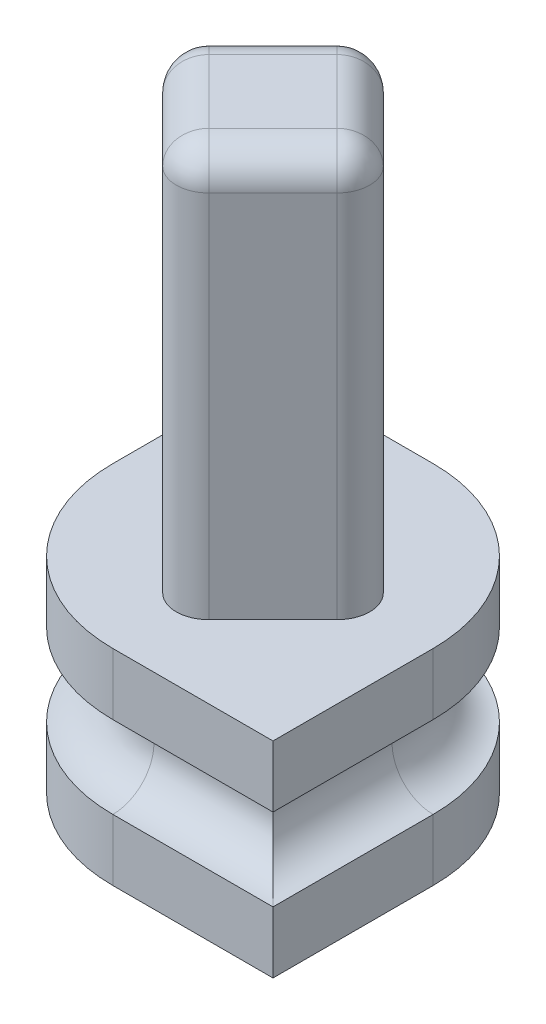
ISO-10303-21;
HEADER;
FILE_DESCRIPTION(('STEP AP214'),'2;1');
FILE_NAME('part.step','',(''),(''),'','','');
FILE_SCHEMA(('AUTOMOTIVE_DESIGN { 1 0 10303 214 1 1 1 1 }'));
ENDSEC;
DATA;
#1=APPLICATION_CONTEXT('core data for automotive mechanical design processes');
#2=APPLICATION_PROTOCOL_DEFINITION('international standard','automotive_design',2000,#1);
#3=PRODUCT_CONTEXT('',#1,'mechanical');
#4=PRODUCT('Part','Part','',(#3));
#5=PRODUCT_RELATED_PRODUCT_CATEGORY('part','',(#4));
#6=PRODUCT_DEFINITION_FORMATION('','',#4);
#7=PRODUCT_DEFINITION_CONTEXT('part definition',#1,'design');
#8=PRODUCT_DEFINITION('design','',#6,#7);
#9=PRODUCT_DEFINITION_SHAPE('','',#8);
#10=(LENGTH_UNIT() NAMED_UNIT(*) SI_UNIT(.MILLI.,.METRE.));
#11=(NAMED_UNIT(*) PLANE_ANGLE_UNIT() SI_UNIT($,.RADIAN.));
#12=(NAMED_UNIT(*) SI_UNIT($,.STERADIAN.) SOLID_ANGLE_UNIT());
#13=UNCERTAINTY_MEASURE_WITH_UNIT(LENGTH_MEASURE(1.E-05),#10,'distance_accuracy_value','');
#14=(GEOMETRIC_REPRESENTATION_CONTEXT(3) GLOBAL_UNCERTAINTY_ASSIGNED_CONTEXT((#13)) GLOBAL_UNIT_ASSIGNED_CONTEXT((#10,
#11,#12)) REPRESENTATION_CONTEXT('',''));
#15=CARTESIAN_POINT('',(0.,0.,0.));
#16=DIRECTION('',(0.,0.,1.));
#17=DIRECTION('',(1.,0.,0.));
#18=AXIS2_PLACEMENT_3D('',#15,#16,#17);
#19=CARTESIAN_POINT('',(3.9,5.,0.));
#20=DIRECTION('',(-1.,0.,0.));
#21=DIRECTION('',(0.,0.,1.));
#22=AXIS2_PLACEMENT_3D('',#19,#20,#21);
#23=PLANE('',#22);
#24=DIRECTION('',(0.,-1.,0.));
#25=VECTOR('',#24,1.);
#26=CARTESIAN_POINT('',(3.9,5.,3.9));
#27=LINE('',#26,#25);
#28=CARTESIAN_POINT('',(3.9,5.,3.9));
#29=VERTEX_POINT('',#28);
#30=CARTESIAN_POINT('',(3.9,3.5,3.9));
#31=VERTEX_POINT('',#30);
#32=EDGE_CURVE('E238',#29,#31,#27,.T.);
#33=ORIENTED_EDGE('',*,*,#32,.T.);
#34=DIRECTION('',(0.,0.,-1.));
#35=VECTOR('',#34,1.);
#36=CARTESIAN_POINT('',(3.9,3.5,0.));
#37=LINE('',#36,#35);
#38=CARTESIAN_POINT('',(3.9,3.5,0.));
#39=VERTEX_POINT('',#38);
#40=EDGE_CURVE('E429',#31,#39,#37,.T.);
#41=ORIENTED_EDGE('',*,*,#40,.T.);
#42=DIRECTION('',(0.,-1.,0.));
#43=VECTOR('',#42,1.);
#44=CARTESIAN_POINT('',(3.9,5.,0.));
#45=LINE('',#44,#43);
#46=CARTESIAN_POINT('',(3.9,5.,0.));
#47=VERTEX_POINT('',#46);
#48=EDGE_CURVE('E263',#47,#39,#45,.T.);
#49=ORIENTED_EDGE('',*,*,#48,.F.);
#50=DIRECTION('',(0.,0.,-1.));
#51=VECTOR('',#50,1.);
#52=CARTESIAN_POINT('',(3.9,5.,0.));
#53=LINE('',#52,#51);
#54=EDGE_CURVE('E380',#29,#47,#53,.T.);
#55=ORIENTED_EDGE('',*,*,#54,.F.);
#56=EDGE_LOOP('',(#33,#41,#49,#55));
#57=FACE_BOUND('',#56,.T.);
#58=ADVANCED_FACE('F33',(#57),#23,.F.);
#59=CARTESIAN_POINT('',(0.,5.,0.));
#60=DIRECTION('',(0.,-1.,0.));
#61=DIRECTION('',(0.,0.,-1.));
#62=AXIS2_PLACEMENT_3D('',#59,#60,#61);
#63=CYLINDRICAL_SURFACE('',#62,3.9);
#64=ORIENTED_EDGE('',*,*,#48,.T.);
#65=CARTESIAN_POINT('',(0.,3.5,0.));
#66=DIRECTION('',(0.,1.,0.));
#67=DIRECTION('',(0.,0.,1.));
#68=AXIS2_PLACEMENT_3D('',#65,#66,#67);
#69=CIRCLE('',#68,3.9);
#70=CARTESIAN_POINT('',(0.,3.5,-3.9));
#71=VERTEX_POINT('',#70);
#72=EDGE_CURVE('E432',#39,#71,#69,.T.);
#73=ORIENTED_EDGE('',*,*,#72,.T.);
#74=DIRECTION('',(0.,-1.,0.));
#75=VECTOR('',#74,1.);
#76=CARTESIAN_POINT('',(0.,5.,-3.9));
#77=LINE('',#76,#75);
#78=CARTESIAN_POINT('',(0.,5.,-3.9));
#79=VERTEX_POINT('',#78);
#80=EDGE_CURVE('E260',#79,#71,#77,.T.);
#81=ORIENTED_EDGE('',*,*,#80,.F.);
#82=CARTESIAN_POINT('',(0.,5.,0.));
#83=DIRECTION('',(0.,1.,0.));
#84=DIRECTION('',(0.,0.,1.));
#85=AXIS2_PLACEMENT_3D('',#82,#83,#84);
#86=CIRCLE('',#85,3.9);
#87=EDGE_CURVE('E383',#47,#79,#86,.T.);
#88=ORIENTED_EDGE('',*,*,#87,.F.);
#89=EDGE_LOOP('',(#64,#73,#81,#88));
#90=FACE_BOUND('',#89,.T.);
#91=ADVANCED_FACE('F489',(#90),#63,.T.);
#92=CARTESIAN_POINT('',(-3.9,5.,-3.9));
#93=DIRECTION('',(0.,0.,1.));
#94=DIRECTION('',(1.,0.,0.));
#95=AXIS2_PLACEMENT_3D('',#92,#93,#94);
#96=PLANE('',#95);
#97=ORIENTED_EDGE('',*,*,#80,.T.);
#98=DIRECTION('',(-1.,0.,0.));
#99=VECTOR('',#98,1.);
#100=CARTESIAN_POINT('',(-3.9,3.5,-3.9));
#101=LINE('',#100,#99);
#102=CARTESIAN_POINT('',(-3.9,3.5,-3.9));
#103=VERTEX_POINT('',#102);
#104=EDGE_CURVE('E434',#71,#103,#101,.T.);
#105=ORIENTED_EDGE('',*,*,#104,.T.);
#106=DIRECTION('',(0.,-1.,0.));
#107=VECTOR('',#106,1.);
#108=CARTESIAN_POINT('',(-3.9,5.,-3.9));
#109=LINE('',#108,#107);
#110=CARTESIAN_POINT('',(-3.9,5.,-3.9));
#111=VERTEX_POINT('',#110);
#112=EDGE_CURVE('E256',#111,#103,#109,.T.);
#113=ORIENTED_EDGE('',*,*,#112,.F.);
#114=DIRECTION('',(-1.,0.,0.));
#115=VECTOR('',#114,1.);
#116=CARTESIAN_POINT('',(-3.9,5.,-3.9));
#117=LINE('',#116,#115);
#118=EDGE_CURVE('E385',#79,#111,#117,.T.);
#119=ORIENTED_EDGE('',*,*,#118,.F.);
#120=EDGE_LOOP('',(#97,#105,#113,#119));
#121=FACE_BOUND('',#120,.T.);
#122=ADVANCED_FACE('F495',(#121),#96,.F.);
#123=CARTESIAN_POINT('',(-3.9,5.,-3.9));
#124=DIRECTION('',(1.,0.,0.));
#125=DIRECTION('',(0.,0.,-1.));
#126=AXIS2_PLACEMENT_3D('',#123,#124,#125);
#127=PLANE('',#126);
#128=ORIENTED_EDGE('',*,*,#112,.T.);
#129=DIRECTION('',(0.,0.,1.));
#130=VECTOR('',#129,1.);
#131=CARTESIAN_POINT('',(-3.9,3.5,0.));
#132=LINE('',#131,#130);
#133=CARTESIAN_POINT('',(-3.9,3.5,0.));
#134=VERTEX_POINT('',#133);
#135=EDGE_CURVE('E436',#103,#134,#132,.T.);
#136=ORIENTED_EDGE('',*,*,#135,.T.);
#137=DIRECTION('',(0.,-1.,0.));
#138=VECTOR('',#137,1.);
#139=CARTESIAN_POINT('',(-3.9,5.,0.));
#140=LINE('',#139,#138);
#141=CARTESIAN_POINT('',(-3.9,5.,0.));
#142=VERTEX_POINT('',#141);
#143=EDGE_CURVE('E252',#142,#134,#140,.T.);
#144=ORIENTED_EDGE('',*,*,#143,.F.);
#145=DIRECTION('',(0.,0.,1.));
#146=VECTOR('',#145,1.);
#147=CARTESIAN_POINT('',(-3.9,5.,-3.9));
#148=LINE('',#147,#146);
#149=EDGE_CURVE('E387',#111,#142,#148,.T.);
#150=ORIENTED_EDGE('',*,*,#149,.F.);
#151=EDGE_LOOP('',(#128,#136,#144,#150));
#152=FACE_BOUND('',#151,.T.);
#153=ADVANCED_FACE('F517',(#152),#127,.F.);
#154=CARTESIAN_POINT('',(0.,5.,0.));
#155=DIRECTION('',(0.,-1.,0.));
#156=DIRECTION('',(0.,0.,-1.));
#157=AXIS2_PLACEMENT_3D('',#154,#155,#156);
#158=CYLINDRICAL_SURFACE('',#157,3.9);
#159=ORIENTED_EDGE('',*,*,#143,.T.);
#160=CARTESIAN_POINT('',(0.,3.5,0.));
#161=DIRECTION('',(0.,1.,0.));
#162=DIRECTION('',(0.,0.,1.));
#163=AXIS2_PLACEMENT_3D('',#160,#161,#162);
#164=CIRCLE('',#163,3.9);
#165=CARTESIAN_POINT('',(0.,3.5,3.9));
#166=VERTEX_POINT('',#165);
#167=EDGE_CURVE('E425',#134,#166,#164,.T.);
#168=ORIENTED_EDGE('',*,*,#167,.T.);
#169=DIRECTION('',(0.,-1.,0.));
#170=VECTOR('',#169,1.);
#171=CARTESIAN_POINT('',(0.,5.,3.9));
#172=LINE('',#171,#170);
#173=CARTESIAN_POINT('',(0.,5.,3.9));
#174=VERTEX_POINT('',#173);
#175=EDGE_CURVE('E248',#174,#166,#172,.T.);
#176=ORIENTED_EDGE('',*,*,#175,.F.);
#177=CARTESIAN_POINT('',(0.,5.,0.));
#178=DIRECTION('',(0.,1.,0.));
#179=DIRECTION('',(0.,0.,1.));
#180=AXIS2_PLACEMENT_3D('',#177,#178,#179);
#181=CIRCLE('',#180,3.9);
#182=EDGE_CURVE('E243',#142,#174,#181,.T.);
#183=ORIENTED_EDGE('',*,*,#182,.F.);
#184=EDGE_LOOP('',(#159,#168,#176,#183));
#185=FACE_BOUND('',#184,.T.);
#186=ADVANCED_FACE('F521',(#185),#158,.T.);
#187=CARTESIAN_POINT('',(0.,5.,3.9));
#188=DIRECTION('',(0.,0.,-1.));
#189=DIRECTION('',(-1.,0.,0.));
#190=AXIS2_PLACEMENT_3D('',#187,#188,#189);
#191=PLANE('',#190);
#192=ORIENTED_EDGE('',*,*,#175,.T.);
#193=DIRECTION('',(1.,0.,0.));
#194=VECTOR('',#193,1.);
#195=CARTESIAN_POINT('',(3.9,3.5,3.9));
#196=LINE('',#195,#194);
#197=EDGE_CURVE('E427',#166,#31,#196,.T.);
#198=ORIENTED_EDGE('',*,*,#197,.T.);
#199=ORIENTED_EDGE('',*,*,#32,.F.);
#200=DIRECTION('',(1.,0.,0.));
#201=VECTOR('',#200,1.);
#202=CARTESIAN_POINT('',(0.,5.,3.9));
#203=LINE('',#202,#201);
#204=EDGE_CURVE('E239',#174,#29,#203,.T.);
#205=ORIENTED_EDGE('',*,*,#204,.F.);
#206=EDGE_LOOP('',(#192,#198,#199,#205));
#207=FACE_BOUND('',#206,.T.);
#208=ADVANCED_FACE('F525',(#207),#191,.F.);
#209=CARTESIAN_POINT('',(0.,5.,0.));
#210=DIRECTION('',(0.,1.,0.));
#211=DIRECTION('',(0.,0.,1.));
#212=AXIS2_PLACEMENT_3D('',#209,#210,#211);
#213=PLANE('',#212);
#214=CARTESIAN_POINT('',(0.,5.,1.55563491861042));
#215=DIRECTION('',(0.,1.,0.));
#216=DIRECTION('',(0.,0.,1.));
#217=AXIS2_PLACEMENT_3D('',#214,#215,#216);
#218=CIRCLE('',#217,0.799999999999999);
#219=CARTESIAN_POINT('',(-0.565685424949237,5.,2.12132034355966));
#220=VERTEX_POINT('',#219);
#221=CARTESIAN_POINT('',(0.565685424949238,5.,2.12132034355966));
#222=VERTEX_POINT('',#221);
#223=EDGE_CURVE('E438',#220,#222,#218,.T.);
#224=ORIENTED_EDGE('',*,*,#223,.F.);
#225=DIRECTION('',(0.707106781186548,0.,0.707106781186547));
#226=VECTOR('',#225,1.);
#227=CARTESIAN_POINT('',(-2.12132034355964,5.,0.565685424949255));
#228=LINE('',#227,#226);
#229=CARTESIAN_POINT('',(-2.12132034355964,5.,0.565685424949255));
#230=VERTEX_POINT('',#229);
#231=EDGE_CURVE('E456',#230,#220,#228,.T.);
#232=ORIENTED_EDGE('',*,*,#231,.F.);
#233=CARTESIAN_POINT('',(-1.5556349186104,5.,0.));
#234=DIRECTION('',(0.,1.,0.));
#235=DIRECTION('',(0.,0.,1.));
#236=AXIS2_PLACEMENT_3D('',#233,#234,#235);
#237=CIRCLE('',#236,0.8);
#238=CARTESIAN_POINT('',(-2.12132034355964,5.,-0.565685424949222));
#239=VERTEX_POINT('',#238);
#240=EDGE_CURVE('E453',#239,#230,#237,.T.);
#241=ORIENTED_EDGE('',*,*,#240,.F.);
#242=DIRECTION('',(-0.707106781186548,0.,0.707106781186547));
#243=VECTOR('',#242,1.);
#244=CARTESIAN_POINT('',(-0.565685424949237,5.,-2.12132034355963));
#245=LINE('',#244,#243);
#246=CARTESIAN_POINT('',(-0.565685424949237,5.,-2.12132034355963));
#247=VERTEX_POINT('',#246);
#248=EDGE_CURVE('E450',#247,#239,#245,.T.);
#249=ORIENTED_EDGE('',*,*,#248,.F.);
#250=CARTESIAN_POINT('',(0.,5.,-1.55563491861039));
#251=DIRECTION('',(0.,1.,0.));
#252=DIRECTION('',(0.,0.,1.));
#253=AXIS2_PLACEMENT_3D('',#250,#251,#252);
#254=CIRCLE('',#253,0.8);
#255=CARTESIAN_POINT('',(0.565685424949239,5.,-2.12132034355963));
#256=VERTEX_POINT('',#255);
#257=EDGE_CURVE('E447',#256,#247,#254,.T.);
#258=ORIENTED_EDGE('',*,*,#257,.F.);
#259=DIRECTION('',(-0.707106781186547,0.,-0.707106781186548));
#260=VECTOR('',#259,1.);
#261=CARTESIAN_POINT('',(0.565685424949239,5.,-2.12132034355963));
#262=LINE('',#261,#260);
#263=CARTESIAN_POINT('',(2.12132034355964,5.,-0.565685424949222));
#264=VERTEX_POINT('',#263);
#265=EDGE_CURVE('E445',#264,#256,#262,.T.);
#266=ORIENTED_EDGE('',*,*,#265,.F.);
#267=CARTESIAN_POINT('',(1.55563491861041,5.,0.));
#268=DIRECTION('',(0.,1.,0.));
#269=DIRECTION('',(0.,0.,-1.));
#270=AXIS2_PLACEMENT_3D('',#267,#268,#269);
#271=CIRCLE('',#270,0.799999999999999);
#272=CARTESIAN_POINT('',(2.12132034355964,5.,0.565685424949254));
#273=VERTEX_POINT('',#272);
#274=EDGE_CURVE('E369',#273,#264,#271,.T.);
#275=ORIENTED_EDGE('',*,*,#274,.F.);
#276=DIRECTION('',(0.707106781186547,0.,-0.707106781186548));
#277=VECTOR('',#276,1.);
#278=CARTESIAN_POINT('',(2.12132034355964,5.,0.565685424949254));
#279=LINE('',#278,#277);
#280=EDGE_CURVE('E441',#222,#273,#279,.T.);
#281=ORIENTED_EDGE('',*,*,#280,.F.);
#282=EDGE_LOOP('',(#224,#232,#241,#249,#258,#266,#275,#281));
#283=FACE_BOUND('',#282,.T.);
#284=ORIENTED_EDGE('',*,*,#54,.T.);
#285=ORIENTED_EDGE('',*,*,#87,.T.);
#286=ORIENTED_EDGE('',*,*,#118,.T.);
#287=ORIENTED_EDGE('',*,*,#149,.T.);
#288=ORIENTED_EDGE('',*,*,#182,.T.);
#289=ORIENTED_EDGE('',*,*,#204,.T.);
#290=EDGE_LOOP('',(#284,#285,#286,#287,#288,#289));
#291=FACE_BOUND('',#290,.T.);
#292=ADVANCED_FACE('F475',(#283,#291),#213,.T.);
#293=CARTESIAN_POINT('',(0.,14.8,1.55563491861042));
#294=DIRECTION('',(0.,-1.,0.));
#295=DIRECTION('',(0.,0.,-1.));
#296=AXIS2_PLACEMENT_3D('',#293,#294,#295);
#297=CYLINDRICAL_SURFACE('',#296,0.799999999999999);
#298=DIRECTION('',(0.,-1.,0.));
#299=VECTOR('',#298,1.);
#300=CARTESIAN_POINT('',(0.565685424949238,14.8,2.12132034355966));
#301=LINE('',#300,#299);
#302=CARTESIAN_POINT('',(0.565685424949238,14.,2.12132034355966));
#303=VERTEX_POINT('',#302);
#304=EDGE_CURVE('E372',#303,#222,#301,.T.);
#305=ORIENTED_EDGE('',*,*,#304,.F.);
#306=CARTESIAN_POINT('',(0.,14.,1.55563491861042));
#307=DIRECTION('',(0.,-1.,0.));
#308=DIRECTION('',(0.,0.,-1.));
#309=AXIS2_PLACEMENT_3D('',#306,#307,#308);
#310=CIRCLE('',#309,0.799999999999999);
#311=CARTESIAN_POINT('',(-0.565685424949237,14.,2.12132034355966));
#312=VERTEX_POINT('',#311);
#313=EDGE_CURVE('E11',#303,#312,#310,.T.);
#314=ORIENTED_EDGE('',*,*,#313,.T.);
#315=DIRECTION('',(0.,-1.,0.));
#316=VECTOR('',#315,1.);
#317=CARTESIAN_POINT('',(-0.565685424949237,14.8,2.12132034355966));
#318=LINE('',#317,#316);
#319=EDGE_CURVE('E459',#312,#220,#318,.T.);
#320=ORIENTED_EDGE('',*,*,#319,.T.);
#321=ORIENTED_EDGE('',*,*,#223,.T.);
#322=EDGE_LOOP('',(#305,#314,#320,#321));
#323=FACE_BOUND('',#322,.T.);
#324=ADVANCED_FACE('F535',(#323),#297,.T.);
#325=CARTESIAN_POINT('',(2.12132034355964,14.8,0.565685424949254));
#326=DIRECTION('',(-0.707106781186548,0.,-0.707106781186548));
#327=DIRECTION('',(-0.707106781186547,0.,0.707106781186548));
#328=AXIS2_PLACEMENT_3D('',#325,#326,#327);
#329=PLANE('',#328);
#330=DIRECTION('',(0.,-1.,0.));
#331=VECTOR('',#330,1.);
#332=CARTESIAN_POINT('',(2.12132034355964,14.8,0.565685424949254));
#333=LINE('',#332,#331);
#334=CARTESIAN_POINT('',(2.12132034355964,14.,0.565685424949254));
#335=VERTEX_POINT('',#334);
#336=EDGE_CURVE('E370',#335,#273,#333,.T.);
#337=ORIENTED_EDGE('',*,*,#336,.F.);
#338=DIRECTION('',(0.707106781186547,0.,-0.707106781186548));
#339=VECTOR('',#338,1.);
#340=CARTESIAN_POINT('',(0.565685424949238,14.,2.12132034355966));
#341=LINE('',#340,#339);
#342=EDGE_CURVE('E42',#335,#303,#341,.F.);
#343=ORIENTED_EDGE('',*,*,#342,.T.);
#344=ORIENTED_EDGE('',*,*,#304,.T.);
#345=ORIENTED_EDGE('',*,*,#280,.T.);
#346=EDGE_LOOP('',(#337,#343,#344,#345));
#347=FACE_BOUND('',#346,.T.);
#348=ADVANCED_FACE('F538',(#347),#329,.F.);
#349=CARTESIAN_POINT('',(1.55563491861041,14.8,0.));
#350=DIRECTION('',(0.,-1.,0.));
#351=DIRECTION('',(0.,0.,-1.));
#352=AXIS2_PLACEMENT_3D('',#349,#350,#351);
#353=CYLINDRICAL_SURFACE('',#352,0.799999999999999);
#354=DIRECTION('',(0.,-1.,0.));
#355=VECTOR('',#354,1.);
#356=CARTESIAN_POINT('',(2.12132034355964,14.8,-0.565685424949222));
#357=LINE('',#356,#355);
#358=CARTESIAN_POINT('',(2.12132034355964,14.,-0.565685424949222));
#359=VERTEX_POINT('',#358);
#360=EDGE_CURVE('E363',#359,#264,#357,.T.);
#361=ORIENTED_EDGE('',*,*,#360,.F.);
#362=CARTESIAN_POINT('',(1.55563491861041,14.,0.));
#363=DIRECTION('',(0.,-1.,0.));
#364=DIRECTION('',(0.,0.,-1.));
#365=AXIS2_PLACEMENT_3D('',#362,#363,#364);
#366=CIRCLE('',#365,0.799999999999999);
#367=EDGE_CURVE('E57',#359,#335,#366,.T.);
#368=ORIENTED_EDGE('',*,*,#367,.T.);
#369=ORIENTED_EDGE('',*,*,#336,.T.);
#370=ORIENTED_EDGE('',*,*,#274,.T.);
#371=EDGE_LOOP('',(#361,#368,#369,#370));
#372=FACE_BOUND('',#371,.T.);
#373=ADVANCED_FACE('F367',(#372),#353,.T.);
#374=CARTESIAN_POINT('',(0.565685424949239,14.8,-2.12132034355963));
#375=DIRECTION('',(-0.707106781186548,0.,0.707106781186547));
#376=DIRECTION('',(0.707106781186547,0.,0.707106781186548));
#377=AXIS2_PLACEMENT_3D('',#374,#375,#376);
#378=PLANE('',#377);
#379=DIRECTION('',(0.,-1.,0.));
#380=VECTOR('',#379,1.);
#381=CARTESIAN_POINT('',(0.565685424949239,14.8,-2.12132034355963));
#382=LINE('',#381,#380);
#383=CARTESIAN_POINT('',(0.565685424949239,14.,-2.12132034355963));
#384=VERTEX_POINT('',#383);
#385=EDGE_CURVE('E365',#384,#256,#382,.T.);
#386=ORIENTED_EDGE('',*,*,#385,.F.);
#387=DIRECTION('',(-0.707106781186547,0.,-0.707106781186548));
#388=VECTOR('',#387,1.);
#389=CARTESIAN_POINT('',(2.12132034355964,14.,-0.565685424949222));
#390=LINE('',#389,#388);
#391=EDGE_CURVE('E325',#384,#359,#390,.F.);
#392=ORIENTED_EDGE('',*,*,#391,.T.);
#393=ORIENTED_EDGE('',*,*,#360,.T.);
#394=ORIENTED_EDGE('',*,*,#265,.T.);
#395=EDGE_LOOP('',(#386,#392,#393,#394));
#396=FACE_BOUND('',#395,.T.);
#397=ADVANCED_FACE('F361',(#396),#378,.F.);
#398=CARTESIAN_POINT('',(0.,14.8,-1.55563491861039));
#399=DIRECTION('',(0.,-1.,0.));
#400=DIRECTION('',(0.,0.,-1.));
#401=AXIS2_PLACEMENT_3D('',#398,#399,#400);
#402=CYLINDRICAL_SURFACE('',#401,0.8);
#403=DIRECTION('',(0.,-1.,0.));
#404=VECTOR('',#403,1.);
#405=CARTESIAN_POINT('',(-0.565685424949237,14.8,-2.12132034355963));
#406=LINE('',#405,#404);
#407=CARTESIAN_POINT('',(-0.565685424949237,14.,-2.12132034355963));
#408=VERTEX_POINT('',#407);
#409=EDGE_CURVE('E374',#408,#247,#406,.T.);
#410=ORIENTED_EDGE('',*,*,#409,.F.);
#411=CARTESIAN_POINT('',(0.,14.,-1.55563491861039));
#412=DIRECTION('',(0.,-1.,0.));
#413=DIRECTION('',(0.,0.,-1.));
#414=AXIS2_PLACEMENT_3D('',#411,#412,#413);
#415=CIRCLE('',#414,0.8);
#416=EDGE_CURVE('E323',#408,#384,#415,.T.);
#417=ORIENTED_EDGE('',*,*,#416,.T.);
#418=ORIENTED_EDGE('',*,*,#385,.T.);
#419=ORIENTED_EDGE('',*,*,#257,.T.);
#420=EDGE_LOOP('',(#410,#417,#418,#419));
#421=FACE_BOUND('',#420,.T.);
#422=ADVANCED_FACE('F478',(#421),#402,.T.);
#423=CARTESIAN_POINT('',(-0.565685424949237,14.8,-2.12132034355963));
#424=DIRECTION('',(0.707106781186547,0.,0.707106781186548));
#425=DIRECTION('',(0.707106781186548,0.,-0.707106781186547));
#426=AXIS2_PLACEMENT_3D('',#423,#424,#425);
#427=PLANE('',#426);
#428=DIRECTION('',(0.,-1.,0.));
#429=VECTOR('',#428,1.);
#430=CARTESIAN_POINT('',(-2.12132034355964,14.8,-0.565685424949222));
#431=LINE('',#430,#429);
#432=CARTESIAN_POINT('',(-2.12132034355964,14.,-0.565685424949222));
#433=VERTEX_POINT('',#432);
#434=EDGE_CURVE('E463',#433,#239,#431,.T.);
#435=ORIENTED_EDGE('',*,*,#434,.F.);
#436=DIRECTION('',(-0.707106781186548,0.,0.707106781186547));
#437=VECTOR('',#436,1.);
#438=CARTESIAN_POINT('',(-0.565685424949236,14.,-2.12132034355963));
#439=LINE('',#438,#437);
#440=EDGE_CURVE('E321',#433,#408,#439,.F.);
#441=ORIENTED_EDGE('',*,*,#440,.T.);
#442=ORIENTED_EDGE('',*,*,#409,.T.);
#443=ORIENTED_EDGE('',*,*,#248,.T.);
#444=EDGE_LOOP('',(#435,#441,#442,#443));
#445=FACE_BOUND('',#444,.T.);
#446=ADVANCED_FACE('F468',(#445),#427,.F.);
#447=CARTESIAN_POINT('',(-1.5556349186104,14.8,0.));
#448=DIRECTION('',(0.,-1.,0.));
#449=DIRECTION('',(0.,0.,-1.));
#450=AXIS2_PLACEMENT_3D('',#447,#448,#449);
#451=CYLINDRICAL_SURFACE('',#450,0.8);
#452=DIRECTION('',(0.,-1.,0.));
#453=VECTOR('',#452,1.);
#454=CARTESIAN_POINT('',(-2.12132034355964,14.8,0.565685424949255));
#455=LINE('',#454,#453);
#456=CARTESIAN_POINT('',(-2.12132034355964,14.,0.565685424949255));
#457=VERTEX_POINT('',#456);
#458=EDGE_CURVE('E461',#457,#230,#455,.T.);
#459=ORIENTED_EDGE('',*,*,#458,.F.);
#460=CARTESIAN_POINT('',(-1.5556349186104,14.,0.));
#461=DIRECTION('',(0.,-1.,0.));
#462=DIRECTION('',(0.,0.,-1.));
#463=AXIS2_PLACEMENT_3D('',#460,#461,#462);
#464=CIRCLE('',#463,0.8);
#465=EDGE_CURVE('E319',#457,#433,#464,.T.);
#466=ORIENTED_EDGE('',*,*,#465,.T.);
#467=ORIENTED_EDGE('',*,*,#434,.T.);
#468=ORIENTED_EDGE('',*,*,#240,.T.);
#469=EDGE_LOOP('',(#459,#466,#467,#468));
#470=FACE_BOUND('',#469,.T.);
#471=ADVANCED_FACE('F485',(#470),#451,.T.);
#472=CARTESIAN_POINT('',(-2.12132034355964,14.8,0.565685424949255));
#473=DIRECTION('',(0.707106781186548,0.,-0.707106781186548));
#474=DIRECTION('',(-0.707106781186548,0.,-0.707106781186548));
#475=AXIS2_PLACEMENT_3D('',#472,#473,#474);
#476=PLANE('',#475);
#477=ORIENTED_EDGE('',*,*,#319,.F.);
#478=DIRECTION('',(0.707106781186548,0.,0.707106781186548));
#479=VECTOR('',#478,1.);
#480=CARTESIAN_POINT('',(-2.12132034355964,14.,0.565685424949255));
#481=LINE('',#480,#479);
#482=EDGE_CURVE('E316',#312,#457,#481,.F.);
#483=ORIENTED_EDGE('',*,*,#482,.T.);
#484=ORIENTED_EDGE('',*,*,#458,.T.);
#485=ORIENTED_EDGE('',*,*,#231,.T.);
#486=EDGE_LOOP('',(#477,#483,#484,#485));
#487=FACE_BOUND('',#486,.T.);
#488=ADVANCED_FACE('F570',(#487),#476,.F.);
#489=CARTESIAN_POINT('',(0.,14.8,1.55563491861042));
#490=DIRECTION('',(0.,1.,0.));
#491=DIRECTION('',(0.,0.,1.));
#492=AXIS2_PLACEMENT_3D('',#489,#490,#491);
#493=PLANE('',#492);
#494=DIRECTION('',(-0.707106781186548,0.,0.707106781186547));
#495=VECTOR('',#494,1.);
#496=CARTESIAN_POINT('',(-1.5556349186104,14.8,0.));
#497=LINE('',#496,#495);
#498=CARTESIAN_POINT('',(0.,14.8,-1.55563491861039));
#499=VERTEX_POINT('',#498);
#500=CARTESIAN_POINT('',(-1.5556349186104,14.8,0.));
#501=VERTEX_POINT('',#500);
#502=EDGE_CURVE('E311',#499,#501,#497,.T.);
#503=ORIENTED_EDGE('',*,*,#502,.T.);
#504=DIRECTION('',(0.707106781186548,0.,0.707106781186548));
#505=VECTOR('',#504,1.);
#506=CARTESIAN_POINT('',(0.,14.8,1.55563491861042));
#507=LINE('',#506,#505);
#508=CARTESIAN_POINT('',(0.,14.8,1.55563491861042));
#509=VERTEX_POINT('',#508);
#510=EDGE_CURVE('E313',#501,#509,#507,.T.);
#511=ORIENTED_EDGE('',*,*,#510,.T.);
#512=DIRECTION('',(0.707106781186547,0.,-0.707106781186548));
#513=VECTOR('',#512,1.);
#514=CARTESIAN_POINT('',(1.55563491861041,14.8,0.));
#515=LINE('',#514,#513);
#516=CARTESIAN_POINT('',(1.55563491861041,14.8,0.));
#517=VERTEX_POINT('',#516);
#518=EDGE_CURVE('E266',#509,#517,#515,.T.);
#519=ORIENTED_EDGE('',*,*,#518,.T.);
#520=DIRECTION('',(-0.707106781186547,0.,-0.707106781186548));
#521=VECTOR('',#520,1.);
#522=CARTESIAN_POINT('',(0.,14.8,-1.55563491861039));
#523=LINE('',#522,#521);
#524=EDGE_CURVE('E309',#517,#499,#523,.T.);
#525=ORIENTED_EDGE('',*,*,#524,.T.);
#526=EDGE_LOOP('',(#503,#511,#519,#525));
#527=FACE_BOUND('',#526,.T.);
#528=ADVANCED_FACE('F532',(#527),#493,.T.);
#529=CARTESIAN_POINT('',(0.,0.,0.));
#530=DIRECTION('',(0.,1.,0.));
#531=DIRECTION('',(0.,0.,1.));
#532=AXIS2_PLACEMENT_3D('',#529,#530,#531);
#533=PLANE('',#532);
#534=DIRECTION('',(0.,0.,-1.));
#535=VECTOR('',#534,1.);
#536=CARTESIAN_POINT('',(3.9,0.,0.));
#537=LINE('',#536,#535);
#538=CARTESIAN_POINT('',(3.9,0.,3.9));
#539=VERTEX_POINT('',#538);
#540=CARTESIAN_POINT('',(3.9,0.,0.));
#541=VERTEX_POINT('',#540);
#542=EDGE_CURVE('E379',#539,#541,#537,.T.);
#543=ORIENTED_EDGE('',*,*,#542,.F.);
#544=DIRECTION('',(1.,0.,0.));
#545=VECTOR('',#544,1.);
#546=CARTESIAN_POINT('',(0.,0.,3.9));
#547=LINE('',#546,#545);
#548=CARTESIAN_POINT('',(0.,0.,3.9));
#549=VERTEX_POINT('',#548);
#550=EDGE_CURVE('E236',#549,#539,#547,.T.);
#551=ORIENTED_EDGE('',*,*,#550,.F.);
#552=CARTESIAN_POINT('',(0.,0.,0.));
#553=DIRECTION('',(0.,1.,0.));
#554=DIRECTION('',(0.,0.,1.));
#555=AXIS2_PLACEMENT_3D('',#552,#553,#554);
#556=CIRCLE('',#555,3.9);
#557=CARTESIAN_POINT('',(-3.9,0.,0.));
#558=VERTEX_POINT('',#557);
#559=EDGE_CURVE('E399',#558,#549,#556,.T.);
#560=ORIENTED_EDGE('',*,*,#559,.F.);
#561=DIRECTION('',(0.,0.,1.));
#562=VECTOR('',#561,1.);
#563=CARTESIAN_POINT('',(-3.9,0.,-3.9));
#564=LINE('',#563,#562);
#565=CARTESIAN_POINT('',(-3.9,0.,-3.9));
#566=VERTEX_POINT('',#565);
#567=EDGE_CURVE('E397',#566,#558,#564,.T.);
#568=ORIENTED_EDGE('',*,*,#567,.F.);
#569=DIRECTION('',(-1.,0.,0.));
#570=VECTOR('',#569,1.);
#571=CARTESIAN_POINT('',(-3.9,0.,-3.9));
#572=LINE('',#571,#570);
#573=CARTESIAN_POINT('',(0.,0.,-3.9));
#574=VERTEX_POINT('',#573);
#575=EDGE_CURVE('E394',#574,#566,#572,.T.);
#576=ORIENTED_EDGE('',*,*,#575,.F.);
#577=CARTESIAN_POINT('',(0.,0.,0.));
#578=DIRECTION('',(0.,1.,0.));
#579=DIRECTION('',(0.,0.,1.));
#580=AXIS2_PLACEMENT_3D('',#577,#578,#579);
#581=CIRCLE('',#580,3.9);
#582=EDGE_CURVE('E391',#541,#574,#581,.T.);
#583=ORIENTED_EDGE('',*,*,#582,.F.);
#584=EDGE_LOOP('',(#543,#551,#560,#568,#576,#583));
#585=FACE_BOUND('',#584,.T.);
#586=ADVANCED_FACE('F408',(#585),#533,.F.);
#587=DIRECTION('',(1.,0.,0.));
#588=VECTOR('',#587,1.);
#589=CARTESIAN_POINT('',(3.9,1.5,3.9));
#590=LINE('',#589,#588);
#591=CARTESIAN_POINT('',(0.,1.5,3.9));
#592=VERTEX_POINT('',#591);
#593=CARTESIAN_POINT('',(3.9,1.5,3.9));
#594=VERTEX_POINT('',#593);
#595=EDGE_CURVE('E216',#592,#594,#590,.T.);
#596=ORIENTED_EDGE('',*,*,#595,.F.);
#597=EDGE_CURVE('E242',#592,#549,#172,.T.);
#598=ORIENTED_EDGE('',*,*,#597,.T.);
#599=ORIENTED_EDGE('',*,*,#550,.T.);
#600=EDGE_CURVE('E228',#594,#539,#27,.T.);
#601=ORIENTED_EDGE('',*,*,#600,.F.);
#602=EDGE_LOOP('',(#596,#598,#599,#601));
#603=FACE_BOUND('',#602,.T.);
#604=ADVANCED_FACE('F234',(#603),#191,.F.);
#605=CARTESIAN_POINT('',(0.,1.5,0.));
#606=DIRECTION('',(0.,1.,0.));
#607=DIRECTION('',(0.,0.,1.));
#608=AXIS2_PLACEMENT_3D('',#605,#606,#607);
#609=CIRCLE('',#608,3.9);
#610=CARTESIAN_POINT('',(-3.9,1.5,0.));
#611=VERTEX_POINT('',#610);
#612=EDGE_CURVE('E222',#611,#592,#609,.T.);
#613=ORIENTED_EDGE('',*,*,#612,.F.);
#614=EDGE_CURVE('E251',#611,#558,#140,.T.);
#615=ORIENTED_EDGE('',*,*,#614,.T.);
#616=ORIENTED_EDGE('',*,*,#559,.T.);
#617=ORIENTED_EDGE('',*,*,#597,.F.);
#618=EDGE_LOOP('',(#613,#615,#616,#617));
#619=FACE_BOUND('',#618,.T.);
#620=ADVANCED_FACE('F403',(#619),#158,.T.);
#621=DIRECTION('',(0.,0.,1.));
#622=VECTOR('',#621,1.);
#623=CARTESIAN_POINT('',(-3.9,1.5,0.));
#624=LINE('',#623,#622);
#625=CARTESIAN_POINT('',(-3.9,1.5,-3.9));
#626=VERTEX_POINT('',#625);
#627=EDGE_CURVE('E420',#626,#611,#624,.T.);
#628=ORIENTED_EDGE('',*,*,#627,.F.);
#629=EDGE_CURVE('E255',#626,#566,#109,.T.);
#630=ORIENTED_EDGE('',*,*,#629,.T.);
#631=ORIENTED_EDGE('',*,*,#567,.T.);
#632=ORIENTED_EDGE('',*,*,#614,.F.);
#633=EDGE_LOOP('',(#628,#630,#631,#632));
#634=FACE_BOUND('',#633,.T.);
#635=ADVANCED_FACE('F512',(#634),#127,.F.);
#636=DIRECTION('',(-1.,0.,0.));
#637=VECTOR('',#636,1.);
#638=CARTESIAN_POINT('',(-3.9,1.5,-3.9));
#639=LINE('',#638,#637);
#640=CARTESIAN_POINT('',(0.,1.5,-3.9));
#641=VERTEX_POINT('',#640);
#642=EDGE_CURVE('E417',#641,#626,#639,.T.);
#643=ORIENTED_EDGE('',*,*,#642,.F.);
#644=EDGE_CURVE('E259',#641,#574,#77,.T.);
#645=ORIENTED_EDGE('',*,*,#644,.T.);
#646=ORIENTED_EDGE('',*,*,#575,.T.);
#647=ORIENTED_EDGE('',*,*,#629,.F.);
#648=EDGE_LOOP('',(#643,#645,#646,#647));
#649=FACE_BOUND('',#648,.T.);
#650=ADVANCED_FACE('F508',(#649),#96,.F.);
#651=CARTESIAN_POINT('',(0.,1.5,0.));
#652=DIRECTION('',(0.,1.,0.));
#653=DIRECTION('',(0.,0.,1.));
#654=AXIS2_PLACEMENT_3D('',#651,#652,#653);
#655=CIRCLE('',#654,3.9);
#656=CARTESIAN_POINT('',(3.9,1.5,0.));
#657=VERTEX_POINT('',#656);
#658=EDGE_CURVE('E232',#657,#641,#655,.T.);
#659=ORIENTED_EDGE('',*,*,#658,.F.);
#660=EDGE_CURVE('E230',#657,#541,#45,.T.);
#661=ORIENTED_EDGE('',*,*,#660,.T.);
#662=ORIENTED_EDGE('',*,*,#582,.T.);
#663=ORIENTED_EDGE('',*,*,#644,.F.);
#664=EDGE_LOOP('',(#659,#661,#662,#663));
#665=FACE_BOUND('',#664,.T.);
#666=ADVANCED_FACE('F413',(#665),#63,.T.);
#667=DIRECTION('',(0.,0.,-1.));
#668=VECTOR('',#667,1.);
#669=CARTESIAN_POINT('',(3.9,1.5,0.));
#670=LINE('',#669,#668);
#671=EDGE_CURVE('E205',#594,#657,#670,.T.);
#672=ORIENTED_EDGE('',*,*,#671,.F.);
#673=ORIENTED_EDGE('',*,*,#600,.T.);
#674=ORIENTED_EDGE('',*,*,#542,.T.);
#675=ORIENTED_EDGE('',*,*,#660,.F.);
#676=EDGE_LOOP('',(#672,#673,#674,#675));
#677=FACE_BOUND('',#676,.T.);
#678=ADVANCED_FACE('F226',(#677),#23,.F.);
#679=CARTESIAN_POINT('',(-3.9,2.5,0.));
#680=DIRECTION('',(0.,0.,1.));
#681=DIRECTION('',(1.,0.,0.));
#682=AXIS2_PLACEMENT_3D('',#679,#680,#681);
#683=CYLINDRICAL_SURFACE('',#682,1.);
#684=CARTESIAN_POINT('',(-3.9,2.5,-3.9));
#685=DIRECTION('',(-0.707106781186547,0.,0.707106781186547));
#686=DIRECTION('',(-0.707106781186547,0.,-0.707106781186547));
#687=AXIS2_PLACEMENT_3D('',#684,#685,#686);
#688=ELLIPSE('',#687,1.41421356237309,1.);
#689=CARTESIAN_POINT('',(-2.9,2.5,-2.9));
#690=VERTEX_POINT('',#689);
#691=EDGE_CURVE('E299',#626,#690,#688,.T.);
#692=ORIENTED_EDGE('',*,*,#691,.F.);
#693=ORIENTED_EDGE('',*,*,#627,.T.);
#694=CARTESIAN_POINT('',(-3.9,2.5,0.));
#695=DIRECTION('',(0.,0.,-1.));
#696=DIRECTION('',(-1.,0.,0.));
#697=AXIS2_PLACEMENT_3D('',#694,#695,#696);
#698=CIRCLE('',#697,1.);
#699=CARTESIAN_POINT('',(-2.9,2.5,0.));
#700=VERTEX_POINT('',#699);
#701=EDGE_CURVE('E305',#700,#611,#698,.T.);
#702=ORIENTED_EDGE('',*,*,#701,.F.);
#703=DIRECTION('',(0.,0.,1.));
#704=VECTOR('',#703,1.);
#705=CARTESIAN_POINT('',(-2.9,2.5,0.));
#706=LINE('',#705,#704);
#707=EDGE_CURVE('E302',#690,#700,#706,.T.);
#708=ORIENTED_EDGE('',*,*,#707,.F.);
#709=EDGE_LOOP('',(#692,#693,#702,#708));
#710=FACE_BOUND('',#709,.T.);
#711=ADVANCED_FACE('F500',(#710),#683,.F.);
#712=CARTESIAN_POINT('',(0.,2.5,0.));
#713=DIRECTION('',(0.,1.,0.));
#714=DIRECTION('',(0.,0.,1.));
#715=AXIS2_PLACEMENT_3D('',#712,#713,#714);
#716=TOROIDAL_SURFACE('',#715,3.9,1.);
#717=ORIENTED_EDGE('',*,*,#701,.T.);
#718=ORIENTED_EDGE('',*,*,#612,.T.);
#719=CARTESIAN_POINT('',(0.,2.5,3.9));
#720=DIRECTION('',(-1.,0.,0.));
#721=DIRECTION('',(0.,0.,1.));
#722=AXIS2_PLACEMENT_3D('',#719,#720,#721);
#723=CIRCLE('',#722,1.);
#724=CARTESIAN_POINT('',(0.,2.5,2.9));
#725=VERTEX_POINT('',#724);
#726=EDGE_CURVE('E218',#725,#592,#723,.T.);
#727=ORIENTED_EDGE('',*,*,#726,.F.);
#728=CARTESIAN_POINT('',(0.,2.5,0.));
#729=DIRECTION('',(0.,1.,0.));
#730=DIRECTION('',(0.,0.,1.));
#731=AXIS2_PLACEMENT_3D('',#728,#729,#730);
#732=CIRCLE('',#731,2.9);
#733=EDGE_CURVE('E295',#700,#725,#732,.T.);
#734=ORIENTED_EDGE('',*,*,#733,.F.);
#735=EDGE_LOOP('',(#717,#718,#727,#734));
#736=FACE_BOUND('',#735,.T.);
#737=ADVANCED_FACE('F505',(#736),#716,.F.);
#738=CARTESIAN_POINT('',(-3.9,2.5,0.));
#739=DIRECTION('',(0.,0.,-1.));
#740=DIRECTION('',(-1.,0.,0.));
#741=AXIS2_PLACEMENT_3D('',#738,#739,#740);
#742=CYLINDRICAL_SURFACE('',#741,1.);
#743=CARTESIAN_POINT('',(-3.9,2.5,-3.9));
#744=DIRECTION('',(0.707106781186547,0.,-0.707106781186547));
#745=DIRECTION('',(-0.707106781186547,0.,-0.707106781186547));
#746=AXIS2_PLACEMENT_3D('',#743,#744,#745);
#747=ELLIPSE('',#746,1.41421356237309,1.);
#748=EDGE_CURVE('E289',#690,#103,#747,.F.);
#749=ORIENTED_EDGE('',*,*,#748,.F.);
#750=ORIENTED_EDGE('',*,*,#707,.T.);
#751=CARTESIAN_POINT('',(-3.9,2.5,0.));
#752=DIRECTION('',(0.,0.,-1.));
#753=DIRECTION('',(-1.,0.,0.));
#754=AXIS2_PLACEMENT_3D('',#751,#752,#753);
#755=CIRCLE('',#754,1.);
#756=EDGE_CURVE('E292',#134,#700,#755,.T.);
#757=ORIENTED_EDGE('',*,*,#756,.F.);
#758=ORIENTED_EDGE('',*,*,#135,.F.);
#759=EDGE_LOOP('',(#749,#750,#757,#758));
#760=FACE_BOUND('',#759,.T.);
#761=ADVANCED_FACE('F673',(#760),#742,.F.);
#762=CARTESIAN_POINT('',(-2.9,2.5,-3.9));
#763=DIRECTION('',(-1.,0.,0.));
#764=DIRECTION('',(0.,0.,1.));
#765=AXIS2_PLACEMENT_3D('',#762,#763,#764);
#766=CYLINDRICAL_SURFACE('',#765,1.);
#767=ORIENTED_EDGE('',*,*,#642,.T.);
#768=ORIENTED_EDGE('',*,*,#691,.T.);
#769=DIRECTION('',(-1.,0.,0.));
#770=VECTOR('',#769,1.);
#771=CARTESIAN_POINT('',(-2.9,2.5,-2.9));
#772=LINE('',#771,#770);
#773=CARTESIAN_POINT('',(0.,2.5,-2.9));
#774=VERTEX_POINT('',#773);
#775=EDGE_CURVE('E286',#774,#690,#772,.T.);
#776=ORIENTED_EDGE('',*,*,#775,.F.);
#777=CARTESIAN_POINT('',(0.,2.5,-3.9));
#778=DIRECTION('',(-1.,0.,0.));
#779=DIRECTION('',(0.,0.,1.));
#780=AXIS2_PLACEMENT_3D('',#777,#778,#779);
#781=CIRCLE('',#780,1.);
#782=EDGE_CURVE('E283',#641,#774,#781,.T.);
#783=ORIENTED_EDGE('',*,*,#782,.F.);
#784=EDGE_LOOP('',(#767,#768,#776,#783));
#785=FACE_BOUND('',#784,.T.);
#786=ADVANCED_FACE('F677',(#785),#766,.F.);
#787=CARTESIAN_POINT('',(2.9,2.5,3.9));
#788=DIRECTION('',(1.,0.,0.));
#789=DIRECTION('',(0.,0.,-1.));
#790=AXIS2_PLACEMENT_3D('',#787,#788,#789);
#791=CYLINDRICAL_SURFACE('',#790,1.);
#792=ORIENTED_EDGE('',*,*,#726,.T.);
#793=ORIENTED_EDGE('',*,*,#595,.T.);
#794=CARTESIAN_POINT('',(3.9,2.5,3.9));
#795=DIRECTION('',(0.707106781186547,0.,-0.707106781186547));
#796=DIRECTION('',(0.707106781186547,0.,0.707106781186547));
#797=AXIS2_PLACEMENT_3D('',#794,#795,#796);
#798=ELLIPSE('',#797,1.41421356237309,1.);
#799=CARTESIAN_POINT('',(2.9,2.5,2.9));
#800=VERTEX_POINT('',#799);
#801=EDGE_CURVE('E201',#800,#594,#798,.F.);
#802=ORIENTED_EDGE('',*,*,#801,.F.);
#803=DIRECTION('',(1.,0.,0.));
#804=VECTOR('',#803,1.);
#805=CARTESIAN_POINT('',(2.9,2.5,2.9));
#806=LINE('',#805,#804);
#807=EDGE_CURVE('E213',#725,#800,#806,.T.);
#808=ORIENTED_EDGE('',*,*,#807,.F.);
#809=EDGE_LOOP('',(#792,#793,#802,#808));
#810=FACE_BOUND('',#809,.T.);
#811=ADVANCED_FACE('F217',(#810),#791,.F.);
#812=CARTESIAN_POINT('',(0.,2.5,0.));
#813=DIRECTION('',(0.,1.,0.));
#814=DIRECTION('',(0.,0.,1.));
#815=AXIS2_PLACEMENT_3D('',#812,#813,#814);
#816=TOROIDAL_SURFACE('',#815,3.9,1.);
#817=ORIENTED_EDGE('',*,*,#756,.T.);
#818=ORIENTED_EDGE('',*,*,#733,.T.);
#819=CARTESIAN_POINT('',(0.,2.5,3.9));
#820=DIRECTION('',(-1.,0.,0.));
#821=DIRECTION('',(0.,0.,1.));
#822=AXIS2_PLACEMENT_3D('',#819,#820,#821);
#823=CIRCLE('',#822,1.);
#824=EDGE_CURVE('E278',#166,#725,#823,.T.);
#825=ORIENTED_EDGE('',*,*,#824,.F.);
#826=ORIENTED_EDGE('',*,*,#167,.F.);
#827=EDGE_LOOP('',(#817,#818,#825,#826));
#828=FACE_BOUND('',#827,.T.);
#829=ADVANCED_FACE('F684',(#828),#816,.F.);
#830=CARTESIAN_POINT('',(0.,2.5,-3.9));
#831=DIRECTION('',(1.,0.,0.));
#832=DIRECTION('',(0.,0.,-1.));
#833=AXIS2_PLACEMENT_3D('',#830,#831,#832);
#834=CYLINDRICAL_SURFACE('',#833,1.);
#835=ORIENTED_EDGE('',*,*,#748,.T.);
#836=ORIENTED_EDGE('',*,*,#104,.F.);
#837=CARTESIAN_POINT('',(0.,2.5,-3.9));
#838=DIRECTION('',(-1.,0.,0.));
#839=DIRECTION('',(0.,0.,1.));
#840=AXIS2_PLACEMENT_3D('',#837,#838,#839);
#841=CIRCLE('',#840,1.);
#842=EDGE_CURVE('E275',#774,#71,#841,.T.);
#843=ORIENTED_EDGE('',*,*,#842,.F.);
#844=ORIENTED_EDGE('',*,*,#775,.T.);
#845=EDGE_LOOP('',(#835,#836,#843,#844));
#846=FACE_BOUND('',#845,.T.);
#847=ADVANCED_FACE('F687',(#846),#834,.F.);
#848=CARTESIAN_POINT('',(0.,2.5,0.));
#849=DIRECTION('',(0.,1.,0.));
#850=DIRECTION('',(0.,0.,1.));
#851=AXIS2_PLACEMENT_3D('',#848,#849,#850);
#852=TOROIDAL_SURFACE('',#851,3.9,1.);
#853=CARTESIAN_POINT('',(3.9,2.5,0.));
#854=DIRECTION('',(0.,0.,-1.));
#855=DIRECTION('',(-1.,0.,0.));
#856=AXIS2_PLACEMENT_3D('',#853,#854,#855);
#857=CIRCLE('',#856,1.);
#858=CARTESIAN_POINT('',(2.9,2.5,0.));
#859=VERTEX_POINT('',#858);
#860=EDGE_CURVE('E212',#657,#859,#857,.T.);
#861=ORIENTED_EDGE('',*,*,#860,.F.);
#862=ORIENTED_EDGE('',*,*,#658,.T.);
#863=ORIENTED_EDGE('',*,*,#782,.T.);
#864=CARTESIAN_POINT('',(0.,2.5,0.));
#865=DIRECTION('',(0.,1.,0.));
#866=DIRECTION('',(0.,0.,1.));
#867=AXIS2_PLACEMENT_3D('',#864,#865,#866);
#868=CIRCLE('',#867,2.9);
#869=EDGE_CURVE('E272',#859,#774,#868,.T.);
#870=ORIENTED_EDGE('',*,*,#869,.F.);
#871=EDGE_LOOP('',(#861,#862,#863,#870));
#872=FACE_BOUND('',#871,.T.);
#873=ADVANCED_FACE('F691',(#872),#852,.F.);
#874=CARTESIAN_POINT('',(3.9,2.5,0.));
#875=DIRECTION('',(0.,0.,-1.));
#876=DIRECTION('',(-1.,0.,0.));
#877=AXIS2_PLACEMENT_3D('',#874,#875,#876);
#878=CYLINDRICAL_SURFACE('',#877,1.);
#879=ORIENTED_EDGE('',*,*,#671,.T.);
#880=ORIENTED_EDGE('',*,*,#860,.T.);
#881=DIRECTION('',(0.,0.,-1.));
#882=VECTOR('',#881,1.);
#883=CARTESIAN_POINT('',(2.9,2.5,0.));
#884=LINE('',#883,#882);
#885=EDGE_CURVE('E207',#800,#859,#884,.T.);
#886=ORIENTED_EDGE('',*,*,#885,.F.);
#887=ORIENTED_EDGE('',*,*,#801,.T.);
#888=EDGE_LOOP('',(#879,#880,#886,#887));
#889=FACE_BOUND('',#888,.T.);
#890=ADVANCED_FACE('F203',(#889),#878,.F.);
#891=CARTESIAN_POINT('',(0.,2.5,3.9));
#892=DIRECTION('',(-1.,0.,0.));
#893=DIRECTION('',(0.,0.,1.));
#894=AXIS2_PLACEMENT_3D('',#891,#892,#893);
#895=CYLINDRICAL_SURFACE('',#894,1.);
#896=ORIENTED_EDGE('',*,*,#824,.T.);
#897=ORIENTED_EDGE('',*,*,#807,.T.);
#898=CARTESIAN_POINT('',(3.9,2.5,3.9));
#899=DIRECTION('',(-0.707106781186547,0.,0.707106781186547));
#900=DIRECTION('',(-0.707106781186547,0.,-0.707106781186547));
#901=AXIS2_PLACEMENT_3D('',#898,#899,#900);
#902=ELLIPSE('',#901,1.41421356237309,1.);
#903=EDGE_CURVE('E269',#31,#800,#902,.T.);
#904=ORIENTED_EDGE('',*,*,#903,.F.);
#905=ORIENTED_EDGE('',*,*,#197,.F.);
#906=EDGE_LOOP('',(#896,#897,#904,#905));
#907=FACE_BOUND('',#906,.T.);
#908=ADVANCED_FACE('F697',(#907),#895,.F.);
#909=CARTESIAN_POINT('',(0.,2.5,0.));
#910=DIRECTION('',(0.,1.,0.));
#911=DIRECTION('',(0.,0.,1.));
#912=AXIS2_PLACEMENT_3D('',#909,#910,#911);
#913=TOROIDAL_SURFACE('',#912,3.9,1.);
#914=ORIENTED_EDGE('',*,*,#842,.T.);
#915=ORIENTED_EDGE('',*,*,#72,.F.);
#916=CARTESIAN_POINT('',(3.9,2.5,0.));
#917=DIRECTION('',(0.,0.,-1.));
#918=DIRECTION('',(0.,1.,0.));
#919=AXIS2_PLACEMENT_3D('',#916,#917,#918);
#920=CIRCLE('',#919,1.);
#921=EDGE_CURVE('E267',#859,#39,#920,.T.);
#922=ORIENTED_EDGE('',*,*,#921,.F.);
#923=ORIENTED_EDGE('',*,*,#869,.T.);
#924=EDGE_LOOP('',(#914,#915,#922,#923));
#925=FACE_BOUND('',#924,.T.);
#926=ADVANCED_FACE('F700',(#925),#913,.F.);
#927=CARTESIAN_POINT('',(3.9,2.5,0.));
#928=DIRECTION('',(0.,0.,1.));
#929=DIRECTION('',(1.,0.,0.));
#930=AXIS2_PLACEMENT_3D('',#927,#928,#929);
#931=CYLINDRICAL_SURFACE('',#930,1.);
#932=ORIENTED_EDGE('',*,*,#903,.T.);
#933=ORIENTED_EDGE('',*,*,#885,.T.);
#934=ORIENTED_EDGE('',*,*,#921,.T.);
#935=ORIENTED_EDGE('',*,*,#40,.F.);
#936=EDGE_LOOP('',(#932,#933,#934,#935));
#937=FACE_BOUND('',#936,.T.);
#938=ADVANCED_FACE('F599',(#937),#931,.F.);
#939=CARTESIAN_POINT('',(1.55563491861041,14.,0.));
#940=DIRECTION('',(0.707106781186547,0.,0.707106781186548));
#941=DIRECTION('',(0.707106781186548,0.,-0.707106781186547));
#942=AXIS2_PLACEMENT_3D('',#939,#940,#941);
#943=CYLINDRICAL_SURFACE('',#942,0.8);
#944=CARTESIAN_POINT('',(1.5556349186104,14.,0.));
#945=DIRECTION('',(0.707106781186547,0.,0.707106781186548));
#946=DIRECTION('',(0.707106781186548,0.,-0.707106781186547));
#947=AXIS2_PLACEMENT_3D('',#944,#945,#946);
#948=CIRCLE('',#947,0.8);
#949=EDGE_CURVE('E344',#359,#517,#948,.T.);
#950=ORIENTED_EDGE('',*,*,#949,.F.);
#951=ORIENTED_EDGE('',*,*,#391,.F.);
#952=CARTESIAN_POINT('',(0.,14.,-1.55563491861039));
#953=DIRECTION('',(-0.707106781186548,0.,-0.707106781186547));
#954=DIRECTION('',(-0.707106781186547,0.,0.707106781186548));
#955=AXIS2_PLACEMENT_3D('',#952,#953,#954);
#956=CIRCLE('',#955,0.8);
#957=EDGE_CURVE('E37',#499,#384,#956,.T.);
#958=ORIENTED_EDGE('',*,*,#957,.F.);
#959=ORIENTED_EDGE('',*,*,#524,.F.);
#960=EDGE_LOOP('',(#950,#951,#958,#959));
#961=FACE_BOUND('',#960,.T.);
#962=ADVANCED_FACE('F35',(#961),#943,.T.);
#963=CARTESIAN_POINT('',(0.,14.,-1.55563491861039));
#964=DIRECTION('',(0.,1.,0.));
#965=DIRECTION('',(0.,0.,1.));
#966=AXIS2_PLACEMENT_3D('',#963,#964,#965);
#967=SPHERICAL_SURFACE('',#966,0.8);
#968=ORIENTED_EDGE('',*,*,#957,.T.);
#969=ORIENTED_EDGE('',*,*,#416,.F.);
#970=CARTESIAN_POINT('',(0.,14.,-1.55563491861039));
#971=DIRECTION('',(-0.707106781186548,0.,0.707106781186548));
#972=DIRECTION('',(0.707106781186548,0.,0.707106781186547));
#973=AXIS2_PLACEMENT_3D('',#970,#971,#972);
#974=CIRCLE('',#973,0.8);
#975=EDGE_CURVE('E342',#499,#408,#974,.T.);
#976=ORIENTED_EDGE('',*,*,#975,.F.);
#977=EDGE_LOOP('',(#968,#969,#976));
#978=FACE_BOUND('',#977,.T.);
#979=ADVANCED_FACE('F354',(#978),#967,.T.);
#980=CARTESIAN_POINT('',(1.55563491861041,14.,0.));
#981=DIRECTION('',(0.,1.,0.));
#982=DIRECTION('',(0.,0.,1.));
#983=AXIS2_PLACEMENT_3D('',#980,#981,#982);
#984=SPHERICAL_SURFACE('',#983,0.8);
#985=ORIENTED_EDGE('',*,*,#367,.F.);
#986=ORIENTED_EDGE('',*,*,#949,.T.);
#987=CARTESIAN_POINT('',(1.55563491861041,14.,0.));
#988=DIRECTION('',(-0.707106781186548,0.,0.707106781186547));
#989=DIRECTION('',(0.707106781186547,0.,0.707106781186548));
#990=AXIS2_PLACEMENT_3D('',#987,#988,#989);
#991=CIRCLE('',#990,0.8);
#992=EDGE_CURVE('E339',#335,#517,#991,.T.);
#993=ORIENTED_EDGE('',*,*,#992,.F.);
#994=EDGE_LOOP('',(#985,#986,#993));
#995=FACE_BOUND('',#994,.T.);
#996=ADVANCED_FACE('F609',(#995),#984,.T.);
#997=CARTESIAN_POINT('',(-1.5556349186104,14.,0.));
#998=DIRECTION('',(0.707106781186548,0.,-0.707106781186547));
#999=DIRECTION('',(-0.707106781186547,0.,-0.707106781186548));
#1000=AXIS2_PLACEMENT_3D('',#997,#998,#999);
#1001=CYLINDRICAL_SURFACE('',#1000,0.8);
#1002=ORIENTED_EDGE('',*,*,#975,.T.);
#1003=ORIENTED_EDGE('',*,*,#440,.F.);
#1004=CARTESIAN_POINT('',(-1.5556349186104,14.,0.));
#1005=DIRECTION('',(-0.707106781186548,0.,0.707106781186547));
#1006=DIRECTION('',(0.707106781186547,0.,0.707106781186548));
#1007=AXIS2_PLACEMENT_3D('',#1004,#1005,#1006);
#1008=CIRCLE('',#1007,0.8);
#1009=EDGE_CURVE('E336',#501,#433,#1008,.T.);
#1010=ORIENTED_EDGE('',*,*,#1009,.F.);
#1011=ORIENTED_EDGE('',*,*,#502,.F.);
#1012=EDGE_LOOP('',(#1002,#1003,#1010,#1011));
#1013=FACE_BOUND('',#1012,.T.);
#1014=ADVANCED_FACE('F617',(#1013),#1001,.T.);
#1015=CARTESIAN_POINT('',(0.,14.,1.55563491861042));
#1016=DIRECTION('',(-0.707106781186547,0.,0.707106781186548));
#1017=DIRECTION('',(0.707106781186548,0.,0.707106781186547));
#1018=AXIS2_PLACEMENT_3D('',#1015,#1016,#1017);
#1019=CYLINDRICAL_SURFACE('',#1018,0.8);
#1020=ORIENTED_EDGE('',*,*,#992,.T.);
#1021=ORIENTED_EDGE('',*,*,#518,.F.);
#1022=CARTESIAN_POINT('',(0.,14.,1.55563491861042));
#1023=DIRECTION('',(-0.707106781186548,0.,0.707106781186548));
#1024=DIRECTION('',(0.707106781186548,0.,0.707106781186547));
#1025=AXIS2_PLACEMENT_3D('',#1022,#1023,#1024);
#1026=CIRCLE('',#1025,0.8);
#1027=EDGE_CURVE('E333',#303,#509,#1026,.T.);
#1028=ORIENTED_EDGE('',*,*,#1027,.F.);
#1029=ORIENTED_EDGE('',*,*,#342,.F.);
#1030=EDGE_LOOP('',(#1020,#1021,#1028,#1029));
#1031=FACE_BOUND('',#1030,.T.);
#1032=ADVANCED_FACE('F626',(#1031),#1019,.T.);
#1033=CARTESIAN_POINT('',(-1.5556349186104,14.,0.));
#1034=DIRECTION('',(0.,1.,0.));
#1035=DIRECTION('',(0.,0.,1.));
#1036=AXIS2_PLACEMENT_3D('',#1033,#1034,#1035);
#1037=SPHERICAL_SURFACE('',#1036,0.8);
#1038=ORIENTED_EDGE('',*,*,#1009,.T.);
#1039=ORIENTED_EDGE('',*,*,#465,.F.);
#1040=CARTESIAN_POINT('',(-1.5556349186104,14.,0.));
#1041=DIRECTION('',(0.707106781186548,0.,0.707106781186548));
#1042=DIRECTION('',(0.707106781186547,0.,-0.707106781186548));
#1043=AXIS2_PLACEMENT_3D('',#1040,#1041,#1042);
#1044=CIRCLE('',#1043,0.8);
#1045=EDGE_CURVE('E331',#501,#457,#1044,.T.);
#1046=ORIENTED_EDGE('',*,*,#1045,.F.);
#1047=EDGE_LOOP('',(#1038,#1039,#1046));
#1048=FACE_BOUND('',#1047,.T.);
#1049=ADVANCED_FACE('F636',(#1048),#1037,.T.);
#1050=CARTESIAN_POINT('',(0.,14.,1.55563491861042));
#1051=DIRECTION('',(0.,1.,0.));
#1052=DIRECTION('',(0.,0.,1.));
#1053=AXIS2_PLACEMENT_3D('',#1050,#1051,#1052);
#1054=SPHERICAL_SURFACE('',#1053,0.8);
#1055=ORIENTED_EDGE('',*,*,#313,.F.);
#1056=ORIENTED_EDGE('',*,*,#1027,.T.);
#1057=CARTESIAN_POINT('',(0.,14.,1.55563491861042));
#1058=DIRECTION('',(-0.707106781186548,0.,-0.707106781186548));
#1059=DIRECTION('',(-0.707106781186548,0.,0.707106781186547));
#1060=AXIS2_PLACEMENT_3D('',#1057,#1058,#1059);
#1061=CIRCLE('',#1060,0.8);
#1062=EDGE_CURVE('E329',#312,#509,#1061,.T.);
#1063=ORIENTED_EDGE('',*,*,#1062,.F.);
#1064=EDGE_LOOP('',(#1055,#1056,#1063));
#1065=FACE_BOUND('',#1064,.T.);
#1066=ADVANCED_FACE('F646',(#1065),#1054,.T.);
#1067=CARTESIAN_POINT('',(0.,14.,1.55563491861042));
#1068=DIRECTION('',(-0.707106781186548,0.,-0.707106781186548));
#1069=DIRECTION('',(-0.707106781186548,0.,0.707106781186548));
#1070=AXIS2_PLACEMENT_3D('',#1067,#1068,#1069);
#1071=CYLINDRICAL_SURFACE('',#1070,0.8);
#1072=ORIENTED_EDGE('',*,*,#1045,.T.);
#1073=ORIENTED_EDGE('',*,*,#482,.F.);
#1074=ORIENTED_EDGE('',*,*,#1062,.T.);
#1075=ORIENTED_EDGE('',*,*,#510,.F.);
#1076=EDGE_LOOP('',(#1072,#1073,#1074,#1075));
#1077=FACE_BOUND('',#1076,.T.);
#1078=ADVANCED_FACE('F656',(#1077),#1071,.T.);
#1079=CLOSED_SHELL('',(#58,#91,#122,#153,#186,#208,#292,#324,#348,#373,#397,#422,#446,#471,#488,
#528,#586,#604,#620,#635,#650,#666,#678,#711,#737,#761,#786,#811,#829,#847,#873,#890,#908,#926,
#938,#962,#979,#996,#1014,#1032,#1049,#1066,#1078));
#1080=MANIFOLD_SOLID_BREP('B2',#1079);
#1081=ADVANCED_BREP_SHAPE_REPRESENTATION('',(#18,#1080),#14);
#1082=SHAPE_DEFINITION_REPRESENTATION(#9,#1081);
ENDSEC;
END-ISO-10303-21;
